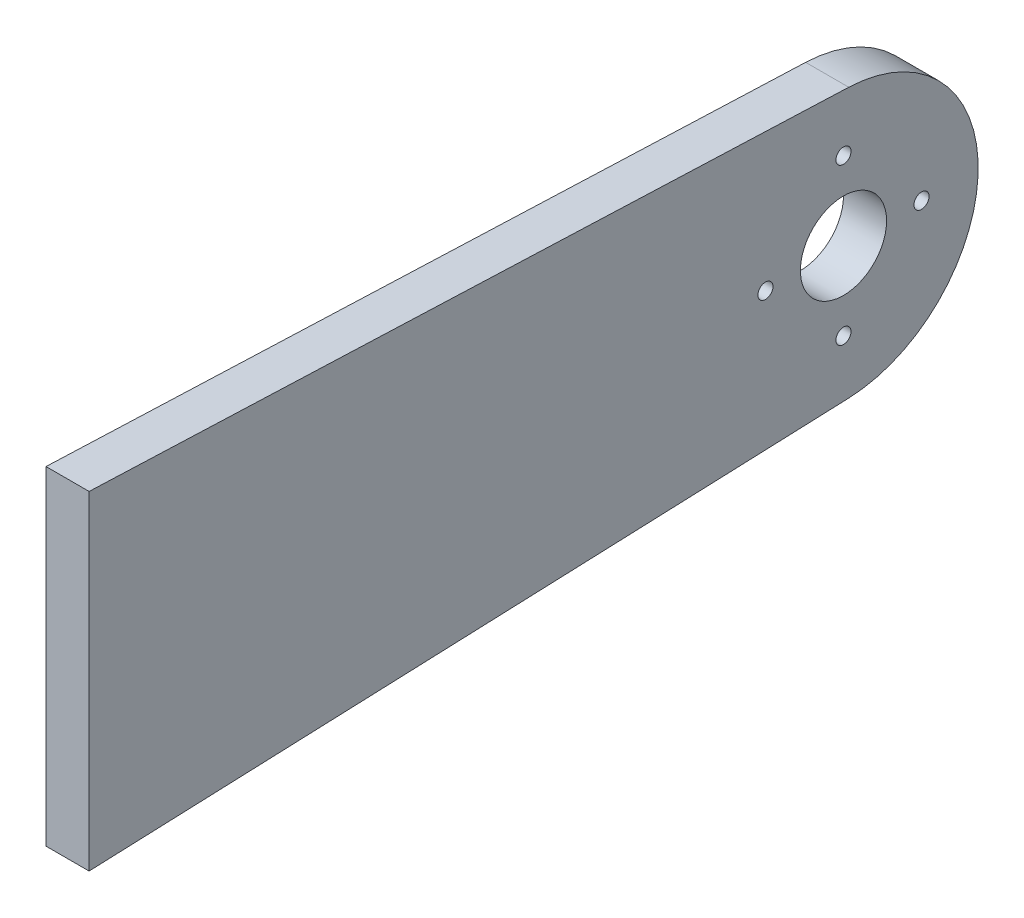
ISO-10303-21;
HEADER;
FILE_DESCRIPTION(('STEP AP214'),'2;1');
FILE_NAME('part.step','',(''),(''),'','','');
FILE_SCHEMA(('AUTOMOTIVE_DESIGN { 1 0 10303 214 1 1 1 1 }'));
ENDSEC;
DATA;
#1=APPLICATION_CONTEXT('core data for automotive mechanical design processes');
#2=APPLICATION_PROTOCOL_DEFINITION('international standard','automotive_design',2000,#1);
#3=PRODUCT_CONTEXT('',#1,'mechanical');
#4=PRODUCT('Part','Part','',(#3));
#5=PRODUCT_RELATED_PRODUCT_CATEGORY('part','',(#4));
#6=PRODUCT_DEFINITION_FORMATION('','',#4);
#7=PRODUCT_DEFINITION_CONTEXT('part definition',#1,'design');
#8=PRODUCT_DEFINITION('design','',#6,#7);
#9=PRODUCT_DEFINITION_SHAPE('','',#8);
#10=(LENGTH_UNIT() NAMED_UNIT(*) SI_UNIT(.MILLI.,.METRE.));
#11=(NAMED_UNIT(*) PLANE_ANGLE_UNIT() SI_UNIT($,.RADIAN.));
#12=(NAMED_UNIT(*) SI_UNIT($,.STERADIAN.) SOLID_ANGLE_UNIT());
#13=UNCERTAINTY_MEASURE_WITH_UNIT(LENGTH_MEASURE(1.E-05),#10,'distance_accuracy_value','');
#14=(GEOMETRIC_REPRESENTATION_CONTEXT(3) GLOBAL_UNCERTAINTY_ASSIGNED_CONTEXT((#13)) GLOBAL_UNIT_ASSIGNED_CONTEXT((#10,
#11,#12)) REPRESENTATION_CONTEXT('',''));
#15=CARTESIAN_POINT('',(0.,0.,0.));
#16=DIRECTION('',(0.,0.,1.));
#17=DIRECTION('',(1.,0.,0.));
#18=AXIS2_PLACEMENT_3D('',#15,#16,#17);
#19=CARTESIAN_POINT('',(4.,0.,0.));
#20=DIRECTION('',(1.,0.,0.));
#21=DIRECTION('',(0.,0.,-1.));
#22=AXIS2_PLACEMENT_3D('',#19,#20,#21);
#23=PLANE('',#22);
#24=CARTESIAN_POINT('',(4.,0.,-7.24));
#25=DIRECTION('',(1.,0.,0.));
#26=DIRECTION('',(0.,0.,-1.));
#27=AXIS2_PLACEMENT_3D('',#24,#25,#26);
#28=CIRCLE('',#27,0.700000000000001);
#29=CARTESIAN_POINT('',(4.,0.,-7.94));
#30=VERTEX_POINT('',#29);
#31=EDGE_CURVE('E127',#30,#30,#28,.T.);
#32=ORIENTED_EDGE('',*,*,#31,.F.);
#33=EDGE_LOOP('',(#32));
#34=FACE_BOUND('',#33,.T.);
#35=CARTESIAN_POINT('',(4.,0.,7.24));
#36=DIRECTION('',(1.,0.,0.));
#37=DIRECTION('',(0.,0.,-1.));
#38=AXIS2_PLACEMENT_3D('',#35,#36,#37);
#39=CIRCLE('',#38,0.7);
#40=CARTESIAN_POINT('',(4.,0.,6.54));
#41=VERTEX_POINT('',#40);
#42=EDGE_CURVE('E115',#41,#41,#39,.T.);
#43=ORIENTED_EDGE('',*,*,#42,.F.);
#44=EDGE_LOOP('',(#43));
#45=FACE_BOUND('',#44,.T.);
#46=DIRECTION('',(0.,0.0391869580785522,0.999231896166525));
#47=VECTOR('',#46,1.);
#48=CARTESIAN_POINT('',(4.,15.2548043391905,70.));
#49=LINE('',#48,#47);
#50=CARTESIAN_POINT('',(4.,12.4903987020816,-0.48983697598192));
#51=VERTEX_POINT('',#50);
#52=CARTESIAN_POINT('',(4.,15.2548043391905,70.));
#53=VERTEX_POINT('',#52);
#54=EDGE_CURVE('E85',#51,#53,#49,.T.);
#55=ORIENTED_EDGE('',*,*,#54,.T.);
#56=DIRECTION('',(0.,-1.,0.));
#57=VECTOR('',#56,1.);
#58=CARTESIAN_POINT('',(4.,15.2548043391905,70.));
#59=LINE('',#58,#57);
#60=CARTESIAN_POINT('',(4.,-15.2548043391906,70.));
#61=VERTEX_POINT('',#60);
#62=EDGE_CURVE('E80',#53,#61,#59,.T.);
#63=ORIENTED_EDGE('',*,*,#62,.T.);
#64=DIRECTION('',(0.,0.039186958078554,-0.999231896166525));
#65=VECTOR('',#64,1.);
#66=CARTESIAN_POINT('',(4.,-15.2548043391906,70.));
#67=LINE('',#66,#65);
#68=CARTESIAN_POINT('',(4.,-12.4903987020816,-0.489836975981916));
#69=VERTEX_POINT('',#68);
#70=EDGE_CURVE('E83',#61,#69,#67,.T.);
#71=ORIENTED_EDGE('',*,*,#70,.T.);
#72=CARTESIAN_POINT('',(4.,0.,0.));
#73=DIRECTION('',(1.,0.,0.));
#74=DIRECTION('',(0.,0.,-1.));
#75=AXIS2_PLACEMENT_3D('',#72,#73,#74);
#76=CIRCLE('',#75,12.5);
#77=EDGE_CURVE('E50',#69,#51,#76,.T.);
#78=ORIENTED_EDGE('',*,*,#77,.T.);
#79=EDGE_LOOP('',(#55,#63,#71,#78));
#80=FACE_BOUND('',#79,.T.);
#81=CARTESIAN_POINT('',(4.,0.,0.));
#82=DIRECTION('',(1.,0.,0.));
#83=DIRECTION('',(0.,0.,-1.));
#84=AXIS2_PLACEMENT_3D('',#81,#82,#83);
#85=CIRCLE('',#84,4.);
#86=CARTESIAN_POINT('',(4.,0.,-4.));
#87=VERTEX_POINT('',#86);
#88=EDGE_CURVE('E100',#87,#87,#85,.T.);
#89=ORIENTED_EDGE('',*,*,#88,.F.);
#90=EDGE_LOOP('',(#89));
#91=FACE_BOUND('',#90,.T.);
#92=CARTESIAN_POINT('',(4.,7.24,0.));
#93=DIRECTION('',(1.,0.,0.));
#94=DIRECTION('',(0.,0.,-1.));
#95=AXIS2_PLACEMENT_3D('',#92,#93,#94);
#96=CIRCLE('',#95,0.7);
#97=CARTESIAN_POINT('',(4.,7.24,-0.699999999999999));
#98=VERTEX_POINT('',#97);
#99=EDGE_CURVE('E121',#98,#98,#96,.T.);
#100=ORIENTED_EDGE('',*,*,#99,.F.);
#101=EDGE_LOOP('',(#100));
#102=FACE_BOUND('',#101,.T.);
#103=CARTESIAN_POINT('',(4.,-7.24,0.));
#104=DIRECTION('',(1.,0.,0.));
#105=DIRECTION('',(0.,0.,-1.));
#106=AXIS2_PLACEMENT_3D('',#103,#104,#105);
#107=CIRCLE('',#106,0.7);
#108=CARTESIAN_POINT('',(4.,-7.24,-0.700000000000001));
#109=VERTEX_POINT('',#108);
#110=EDGE_CURVE('E133',#109,#109,#107,.T.);
#111=ORIENTED_EDGE('',*,*,#110,.F.);
#112=EDGE_LOOP('',(#111));
#113=FACE_BOUND('',#112,.T.);
#114=ADVANCED_FACE('F33',(#34,#45,#80,#91,#102,#113),#23,.T.);
#115=CARTESIAN_POINT('',(0.,0.,0.));
#116=DIRECTION('',(1.,0.,0.));
#117=DIRECTION('',(0.,0.,-1.));
#118=AXIS2_PLACEMENT_3D('',#115,#116,#117);
#119=PLANE('',#118);
#120=DIRECTION('',(0.,0.0391869580785522,0.999231896166525));
#121=VECTOR('',#120,1.);
#122=CARTESIAN_POINT('',(0.,15.2548043391905,70.));
#123=LINE('',#122,#121);
#124=CARTESIAN_POINT('',(0.,12.4903987020816,-0.48983697598192));
#125=VERTEX_POINT('',#124);
#126=CARTESIAN_POINT('',(0.,15.2548043391905,70.));
#127=VERTEX_POINT('',#126);
#128=EDGE_CURVE('E97',#125,#127,#123,.T.);
#129=ORIENTED_EDGE('',*,*,#128,.F.);
#130=CARTESIAN_POINT('',(0.,0.,0.));
#131=DIRECTION('',(1.,0.,0.));
#132=DIRECTION('',(0.,0.,-1.));
#133=AXIS2_PLACEMENT_3D('',#130,#131,#132);
#134=CIRCLE('',#133,12.5);
#135=CARTESIAN_POINT('',(0.,-12.4903987020816,-0.489836975981916));
#136=VERTEX_POINT('',#135);
#137=EDGE_CURVE('E73',#136,#125,#134,.T.);
#138=ORIENTED_EDGE('',*,*,#137,.F.);
#139=DIRECTION('',(0.,0.039186958078554,-0.999231896166525));
#140=VECTOR('',#139,1.);
#141=CARTESIAN_POINT('',(0.,-15.2548043391906,70.));
#142=LINE('',#141,#140);
#143=CARTESIAN_POINT('',(0.,-15.2548043391906,70.));
#144=VERTEX_POINT('',#143);
#145=EDGE_CURVE('E67',#144,#136,#142,.T.);
#146=ORIENTED_EDGE('',*,*,#145,.F.);
#147=DIRECTION('',(0.,-1.,0.));
#148=VECTOR('',#147,1.);
#149=CARTESIAN_POINT('',(0.,15.2548043391905,70.));
#150=LINE('',#149,#148);
#151=EDGE_CURVE('E89',#127,#144,#150,.T.);
#152=ORIENTED_EDGE('',*,*,#151,.F.);
#153=EDGE_LOOP('',(#129,#138,#146,#152));
#154=FACE_BOUND('',#153,.T.);
#155=CARTESIAN_POINT('',(0.,0.,0.));
#156=DIRECTION('',(1.,0.,0.));
#157=DIRECTION('',(0.,0.,-1.));
#158=AXIS2_PLACEMENT_3D('',#155,#156,#157);
#159=CIRCLE('',#158,4.);
#160=CARTESIAN_POINT('',(0.,0.,-4.));
#161=VERTEX_POINT('',#160);
#162=EDGE_CURVE('E112',#161,#161,#159,.T.);
#163=ORIENTED_EDGE('',*,*,#162,.T.);
#164=EDGE_LOOP('',(#163));
#165=FACE_BOUND('',#164,.T.);
#166=CARTESIAN_POINT('',(0.,0.,7.24));
#167=DIRECTION('',(1.,0.,0.));
#168=DIRECTION('',(0.,0.,-1.));
#169=AXIS2_PLACEMENT_3D('',#166,#167,#168);
#170=CIRCLE('',#169,0.7);
#171=CARTESIAN_POINT('',(0.,0.,6.54));
#172=VERTEX_POINT('',#171);
#173=EDGE_CURVE('E118',#172,#172,#170,.T.);
#174=ORIENTED_EDGE('',*,*,#173,.T.);
#175=EDGE_LOOP('',(#174));
#176=FACE_BOUND('',#175,.T.);
#177=CARTESIAN_POINT('',(0.,7.24,0.));
#178=DIRECTION('',(1.,0.,0.));
#179=DIRECTION('',(0.,0.,-1.));
#180=AXIS2_PLACEMENT_3D('',#177,#178,#179);
#181=CIRCLE('',#180,0.7);
#182=CARTESIAN_POINT('',(0.,7.24,-0.699999999999999));
#183=VERTEX_POINT('',#182);
#184=EDGE_CURVE('E124',#183,#183,#181,.T.);
#185=ORIENTED_EDGE('',*,*,#184,.T.);
#186=EDGE_LOOP('',(#185));
#187=FACE_BOUND('',#186,.T.);
#188=CARTESIAN_POINT('',(0.,0.,-7.24));
#189=DIRECTION('',(1.,0.,0.));
#190=DIRECTION('',(0.,0.,-1.));
#191=AXIS2_PLACEMENT_3D('',#188,#189,#190);
#192=CIRCLE('',#191,0.700000000000001);
#193=CARTESIAN_POINT('',(0.,0.,-7.94));
#194=VERTEX_POINT('',#193);
#195=EDGE_CURVE('E130',#194,#194,#192,.T.);
#196=ORIENTED_EDGE('',*,*,#195,.T.);
#197=EDGE_LOOP('',(#196));
#198=FACE_BOUND('',#197,.T.);
#199=CARTESIAN_POINT('',(0.,-7.24,0.));
#200=DIRECTION('',(1.,0.,0.));
#201=DIRECTION('',(0.,0.,-1.));
#202=AXIS2_PLACEMENT_3D('',#199,#200,#201);
#203=CIRCLE('',#202,0.7);
#204=CARTESIAN_POINT('',(0.,-7.24,-0.700000000000001));
#205=VERTEX_POINT('',#204);
#206=EDGE_CURVE('E136',#205,#205,#203,.T.);
#207=ORIENTED_EDGE('',*,*,#206,.T.);
#208=EDGE_LOOP('',(#207));
#209=FACE_BOUND('',#208,.T.);
#210=ADVANCED_FACE('F108',(#154,#165,#176,#187,#198,#209),#119,.F.);
#211=CARTESIAN_POINT('',(4.,15.2548043391905,70.));
#212=DIRECTION('',(0.,-0.999231896166526,0.0391869580785522));
#213=DIRECTION('',(0.,-0.0391869580785522,-0.999231896166526));
#214=AXIS2_PLACEMENT_3D('',#211,#212,#213);
#215=PLANE('',#214);
#216=ORIENTED_EDGE('',*,*,#128,.T.);
#217=DIRECTION('',(-1.,0.,0.));
#218=VECTOR('',#217,1.);
#219=CARTESIAN_POINT('',(4.,15.2548043391905,70.));
#220=LINE('',#219,#218);
#221=EDGE_CURVE('E11',#53,#127,#220,.T.);
#222=ORIENTED_EDGE('',*,*,#221,.F.);
#223=ORIENTED_EDGE('',*,*,#54,.F.);
#224=DIRECTION('',(-1.,0.,0.));
#225=VECTOR('',#224,1.);
#226=CARTESIAN_POINT('',(4.,12.4903987020816,-0.48983697598192));
#227=LINE('',#226,#225);
#228=EDGE_CURVE('E93',#51,#125,#227,.T.);
#229=ORIENTED_EDGE('',*,*,#228,.T.);
#230=EDGE_LOOP('',(#216,#222,#223,#229));
#231=FACE_BOUND('',#230,.T.);
#232=ADVANCED_FACE('F35',(#231),#215,.F.);
#233=CARTESIAN_POINT('',(4.,15.2548043391905,70.));
#234=DIRECTION('',(0.,0.,-1.));
#235=DIRECTION('',(-1.,0.,0.));
#236=AXIS2_PLACEMENT_3D('',#233,#234,#235);
#237=PLANE('',#236);
#238=ORIENTED_EDGE('',*,*,#151,.T.);
#239=DIRECTION('',(-1.,0.,0.));
#240=VECTOR('',#239,1.);
#241=CARTESIAN_POINT('',(4.,-15.2548043391906,70.));
#242=LINE('',#241,#240);
#243=EDGE_CURVE('E42',#61,#144,#242,.T.);
#244=ORIENTED_EDGE('',*,*,#243,.F.);
#245=ORIENTED_EDGE('',*,*,#62,.F.);
#246=ORIENTED_EDGE('',*,*,#221,.T.);
#247=EDGE_LOOP('',(#238,#244,#245,#246));
#248=FACE_BOUND('',#247,.T.);
#249=ADVANCED_FACE('F88',(#248),#237,.F.);
#250=CARTESIAN_POINT('',(4.,-15.2548043391906,70.));
#251=DIRECTION('',(0.,0.999231896166525,0.039186958078554));
#252=DIRECTION('',(0.,-0.039186958078554,0.999231896166526));
#253=AXIS2_PLACEMENT_3D('',#250,#251,#252);
#254=PLANE('',#253);
#255=ORIENTED_EDGE('',*,*,#145,.T.);
#256=DIRECTION('',(-1.,0.,0.));
#257=VECTOR('',#256,1.);
#258=CARTESIAN_POINT('',(4.,-12.4903987020816,-0.489836975981916));
#259=LINE('',#258,#257);
#260=EDGE_CURVE('E90',#69,#136,#259,.T.);
#261=ORIENTED_EDGE('',*,*,#260,.F.);
#262=ORIENTED_EDGE('',*,*,#70,.F.);
#263=ORIENTED_EDGE('',*,*,#243,.T.);
#264=EDGE_LOOP('',(#255,#261,#262,#263));
#265=FACE_BOUND('',#264,.T.);
#266=ADVANCED_FACE('F91',(#265),#254,.F.);
#267=CARTESIAN_POINT('',(4.,0.,0.));
#268=DIRECTION('',(-1.,0.,0.));
#269=DIRECTION('',(0.,0.,1.));
#270=AXIS2_PLACEMENT_3D('',#267,#268,#269);
#271=CYLINDRICAL_SURFACE('',#270,12.5);
#272=ORIENTED_EDGE('',*,*,#137,.T.);
#273=ORIENTED_EDGE('',*,*,#228,.F.);
#274=ORIENTED_EDGE('',*,*,#77,.F.);
#275=ORIENTED_EDGE('',*,*,#260,.T.);
#276=EDGE_LOOP('',(#272,#273,#274,#275));
#277=FACE_BOUND('',#276,.T.);
#278=ADVANCED_FACE('F105',(#277),#271,.T.);
#279=CARTESIAN_POINT('',(4.,0.,0.));
#280=DIRECTION('',(-1.,0.,0.));
#281=DIRECTION('',(0.,0.,1.));
#282=AXIS2_PLACEMENT_3D('',#279,#280,#281);
#283=CYLINDRICAL_SURFACE('',#282,4.);
#284=ORIENTED_EDGE('',*,*,#88,.T.);
#285=EDGE_LOOP('',(#284));
#286=FACE_BOUND('',#285,.T.);
#287=ORIENTED_EDGE('',*,*,#162,.F.);
#288=EDGE_LOOP('',(#287));
#289=FACE_BOUND('',#288,.T.);
#290=ADVANCED_FACE('F155',(#286,#289),#283,.F.);
#291=CARTESIAN_POINT('',(4.,0.,7.24));
#292=DIRECTION('',(-1.,0.,0.));
#293=DIRECTION('',(0.,0.,1.));
#294=AXIS2_PLACEMENT_3D('',#291,#292,#293);
#295=CYLINDRICAL_SURFACE('',#294,0.7);
#296=ORIENTED_EDGE('',*,*,#42,.T.);
#297=EDGE_LOOP('',(#296));
#298=FACE_BOUND('',#297,.T.);
#299=ORIENTED_EDGE('',*,*,#173,.F.);
#300=EDGE_LOOP('',(#299));
#301=FACE_BOUND('',#300,.T.);
#302=ADVANCED_FACE('F201',(#298,#301),#295,.F.);
#303=CARTESIAN_POINT('',(4.,7.24,0.));
#304=DIRECTION('',(-1.,0.,0.));
#305=DIRECTION('',(0.,0.,1.));
#306=AXIS2_PLACEMENT_3D('',#303,#304,#305);
#307=CYLINDRICAL_SURFACE('',#306,0.7);
#308=ORIENTED_EDGE('',*,*,#99,.T.);
#309=EDGE_LOOP('',(#308));
#310=FACE_BOUND('',#309,.T.);
#311=ORIENTED_EDGE('',*,*,#184,.F.);
#312=EDGE_LOOP('',(#311));
#313=FACE_BOUND('',#312,.T.);
#314=ADVANCED_FACE('F209',(#310,#313),#307,.F.);
#315=CARTESIAN_POINT('',(4.,0.,-7.24));
#316=DIRECTION('',(-1.,0.,0.));
#317=DIRECTION('',(0.,0.,1.));
#318=AXIS2_PLACEMENT_3D('',#315,#316,#317);
#319=CYLINDRICAL_SURFACE('',#318,0.700000000000001);
#320=ORIENTED_EDGE('',*,*,#31,.T.);
#321=EDGE_LOOP('',(#320));
#322=FACE_BOUND('',#321,.T.);
#323=ORIENTED_EDGE('',*,*,#195,.F.);
#324=EDGE_LOOP('',(#323));
#325=FACE_BOUND('',#324,.T.);
#326=ADVANCED_FACE('F217',(#322,#325),#319,.F.);
#327=CARTESIAN_POINT('',(4.,-7.24,0.));
#328=DIRECTION('',(-1.,0.,0.));
#329=DIRECTION('',(0.,0.,1.));
#330=AXIS2_PLACEMENT_3D('',#327,#328,#329);
#331=CYLINDRICAL_SURFACE('',#330,0.7);
#332=ORIENTED_EDGE('',*,*,#110,.T.);
#333=EDGE_LOOP('',(#332));
#334=FACE_BOUND('',#333,.T.);
#335=ORIENTED_EDGE('',*,*,#206,.F.);
#336=EDGE_LOOP('',(#335));
#337=FACE_BOUND('',#336,.T.);
#338=ADVANCED_FACE('F142',(#334,#337),#331,.F.);
#339=CLOSED_SHELL('',(#114,#210,#232,#249,#266,#278,#290,#302,#314,#326,#338));
#340=MANIFOLD_SOLID_BREP('B2',#339);
#341=ADVANCED_BREP_SHAPE_REPRESENTATION('',(#18,#340),#14);
#342=SHAPE_DEFINITION_REPRESENTATION(#9,#341);
ENDSEC;
END-ISO-10303-21;
